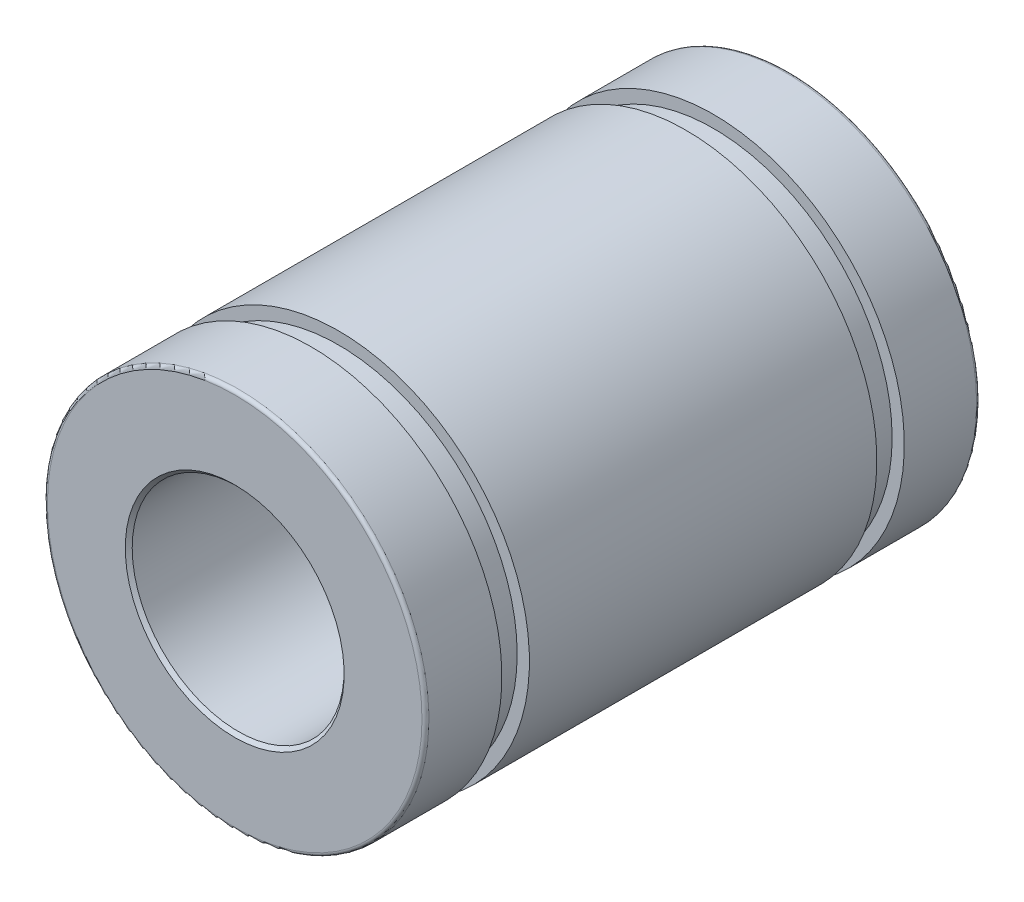
ISO-10303-21;
HEADER;
FILE_DESCRIPTION(('STEP AP214'),'2;1');
FILE_NAME('part.step','',(''),(''),'','','');
FILE_SCHEMA(('AUTOMOTIVE_DESIGN { 1 0 10303 214 1 1 1 1 }'));
ENDSEC;
DATA;
#1=APPLICATION_CONTEXT('core data for automotive mechanical design processes');
#2=APPLICATION_PROTOCOL_DEFINITION('international standard','automotive_design',2000,#1);
#3=PRODUCT_CONTEXT('',#1,'mechanical');
#4=PRODUCT('Part','Part','',(#3));
#5=PRODUCT_RELATED_PRODUCT_CATEGORY('part','',(#4));
#6=PRODUCT_DEFINITION_FORMATION('','',#4);
#7=PRODUCT_DEFINITION_CONTEXT('part definition',#1,'design');
#8=PRODUCT_DEFINITION('design','',#6,#7);
#9=PRODUCT_DEFINITION_SHAPE('','',#8);
#10=(LENGTH_UNIT() NAMED_UNIT(*) SI_UNIT(.MILLI.,.METRE.));
#11=(NAMED_UNIT(*) PLANE_ANGLE_UNIT() SI_UNIT($,.RADIAN.));
#12=(NAMED_UNIT(*) SI_UNIT($,.STERADIAN.) SOLID_ANGLE_UNIT());
#13=UNCERTAINTY_MEASURE_WITH_UNIT(LENGTH_MEASURE(1.E-05),#10,'distance_accuracy_value','');
#14=(GEOMETRIC_REPRESENTATION_CONTEXT(3) GLOBAL_UNCERTAINTY_ASSIGNED_CONTEXT((#13)) GLOBAL_UNIT_ASSIGNED_CONTEXT((#10,
#11,#12)) REPRESENTATION_CONTEXT('',''));
#15=CARTESIAN_POINT('',(0.,0.,0.));
#16=DIRECTION('',(0.,0.,1.));
#17=DIRECTION('',(1.,0.,0.));
#18=AXIS2_PLACEMENT_3D('',#15,#16,#17);
#19=CARTESIAN_POINT('',(0.,0.,0.1000000004571));
#20=DIRECTION('',(0.,0.,-1.));
#21=DIRECTION('',(0.,-1.,0.));
#22=AXIS2_PLACEMENT_3D('',#19,#20,#21);
#23=CONICAL_SURFACE('',#22,6.199999999543,0.785398163397448);
#24=CARTESIAN_POINT('',(0.,0.,0.2));
#25=DIRECTION('',(0.,0.,1.));
#26=DIRECTION('',(-1.,0.,0.));
#27=AXIS2_PLACEMENT_3D('',#24,#25,#26);
#28=CIRCLE('',#27,6.1);
#29=CARTESIAN_POINT('',(-6.1,0.,0.2));
#30=VERTEX_POINT('',#29);
#31=CARTESIAN_POINT('',(0.,6.1,0.200000000000062));
#32=VERTEX_POINT('',#31);
#33=EDGE_CURVE('E195',#30,#32,#28,.T.);
#34=ORIENTED_EDGE('',*,*,#33,.T.);
#35=DIRECTION('',(0.,0.707106781186548,-0.707106781186548));
#36=VECTOR('',#35,1.);
#37=CARTESIAN_POINT('',(0.,6.19999999954298,0.1000000004571));
#38=LINE('',#37,#36);
#39=CARTESIAN_POINT('',(0.,6.3,0.));
#40=VERTEX_POINT('',#39);
#41=EDGE_CURVE('E11',#32,#40,#38,.T.);
#42=ORIENTED_EDGE('',*,*,#41,.T.);
#43=CARTESIAN_POINT('',(0.,0.,0.));
#44=DIRECTION('',(0.,0.,1.));
#45=DIRECTION('',(-1.,0.,0.));
#46=AXIS2_PLACEMENT_3D('',#43,#44,#45);
#47=CIRCLE('',#46,6.3);
#48=EDGE_CURVE('E164',#40,#40,#47,.T.);
#49=ORIENTED_EDGE('',*,*,#48,.F.);
#50=ORIENTED_EDGE('',*,*,#41,.F.);
#51=CARTESIAN_POINT('',(0.,0.,0.2));
#52=DIRECTION('',(0.,0.,1.));
#53=DIRECTION('',(-1.,0.,0.));
#54=AXIS2_PLACEMENT_3D('',#51,#52,#53);
#55=CIRCLE('',#54,6.1);
#56=EDGE_CURVE('E28',#32,#30,#55,.T.);
#57=ORIENTED_EDGE('',*,*,#56,.T.);
#58=EDGE_LOOP('',(#34,#42,#49,#50,#57));
#59=FACE_BOUND('',#58,.T.);
#60=ADVANCED_FACE('F17',(#59),#23,.F.);
#61=CARTESIAN_POINT('',(0.,0.,0.));
#62=DIRECTION('',(0.,0.,1.));
#63=DIRECTION('',(1.,0.,0.));
#64=AXIS2_PLACEMENT_3D('',#61,#62,#63);
#65=CYLINDRICAL_SURFACE('',#64,6.1);
#66=ORIENTED_EDGE('',*,*,#33,.F.);
#67=DIRECTION('',(0.,0.,1.));
#68=VECTOR('',#67,1.);
#69=CARTESIAN_POINT('',(-6.1,0.,0.));
#70=LINE('',#69,#68);
#71=CARTESIAN_POINT('',(-6.1,0.,31.72));
#72=VERTEX_POINT('',#71);
#73=EDGE_CURVE('E199',#30,#72,#70,.T.);
#74=ORIENTED_EDGE('',*,*,#73,.T.);
#75=CARTESIAN_POINT('',(0.,0.,31.72));
#76=DIRECTION('',(0.,0.,-1.));
#77=DIRECTION('',(-1.,0.,0.));
#78=AXIS2_PLACEMENT_3D('',#75,#76,#77);
#79=CIRCLE('',#78,6.1);
#80=CARTESIAN_POINT('',(0.,6.1000000000015,31.7199999999985));
#81=VERTEX_POINT('',#80);
#82=EDGE_CURVE('E155',#81,#72,#79,.T.);
#83=ORIENTED_EDGE('',*,*,#82,.F.);
#84=CARTESIAN_POINT('',(0.,0.,31.72));
#85=DIRECTION('',(0.,0.,-1.));
#86=DIRECTION('',(-1.,0.,0.));
#87=AXIS2_PLACEMENT_3D('',#84,#85,#86);
#88=CIRCLE('',#87,6.1);
#89=EDGE_CURVE('E159',#72,#81,#88,.T.);
#90=ORIENTED_EDGE('',*,*,#89,.F.);
#91=ORIENTED_EDGE('',*,*,#73,.F.);
#92=ORIENTED_EDGE('',*,*,#56,.F.);
#93=EDGE_LOOP('',(#66,#74,#83,#90,#91,#92));
#94=FACE_BOUND('',#93,.T.);
#95=ADVANCED_FACE('F252',(#94),#65,.F.);
#96=CARTESIAN_POINT('',(0.,0.,31.81999999954));
#97=DIRECTION('',(0.,0.,1.));
#98=DIRECTION('',(0.,-1.,0.));
#99=AXIS2_PLACEMENT_3D('',#96,#97,#98);
#100=CONICAL_SURFACE('',#99,6.199999999543,0.785398163397448);
#101=ORIENTED_EDGE('',*,*,#82,.T.);
#102=ORIENTED_EDGE('',*,*,#89,.T.);
#103=DIRECTION('',(0.,0.707106781186548,0.707106781186548));
#104=VECTOR('',#103,1.);
#105=CARTESIAN_POINT('',(0.,6.199999999543,31.81999999954));
#106=LINE('',#105,#104);
#107=CARTESIAN_POINT('',(0.,6.3000000000015,31.9199999999985));
#108=VERTEX_POINT('',#107);
#109=EDGE_CURVE('E192',#81,#108,#106,.T.);
#110=ORIENTED_EDGE('',*,*,#109,.T.);
#111=CARTESIAN_POINT('',(0.,0.,31.92));
#112=DIRECTION('',(0.,0.,-1.));
#113=DIRECTION('',(-1.,0.,0.));
#114=AXIS2_PLACEMENT_3D('',#111,#112,#113);
#115=CIRCLE('',#114,6.3);
#116=EDGE_CURVE('E160',#108,#108,#115,.T.);
#117=ORIENTED_EDGE('',*,*,#116,.F.);
#118=ORIENTED_EDGE('',*,*,#109,.F.);
#119=EDGE_LOOP('',(#101,#102,#110,#117,#118));
#120=FACE_BOUND('',#119,.T.);
#121=ADVANCED_FACE('F257',(#120),#100,.F.);
#122=CARTESIAN_POINT('',(0.,0.,31.92));
#123=DIRECTION('',(0.,0.,1.));
#124=DIRECTION('',(1.,0.,0.));
#125=AXIS2_PLACEMENT_3D('',#122,#123,#124);
#126=PLANE('',#125);
#127=ORIENTED_EDGE('',*,*,#116,.T.);
#128=EDGE_LOOP('',(#127));
#129=FACE_BOUND('',#128,.T.);
#130=CARTESIAN_POINT('',(0.,0.,31.92));
#131=DIRECTION('',(0.,0.,1.));
#132=DIRECTION('',(1.,0.,0.));
#133=AXIS2_PLACEMENT_3D('',#130,#131,#132);
#134=CIRCLE('',#133,10.78);
#135=CARTESIAN_POINT('',(-10.7797902250438,0.0672510524055583,31.92));
#136=VERTEX_POINT('',#135);
#137=EDGE_CURVE('E122',#136,#136,#134,.T.);
#138=ORIENTED_EDGE('',*,*,#137,.T.);
#139=EDGE_LOOP('',(#138));
#140=FACE_BOUND('',#139,.T.);
#141=ADVANCED_FACE('F19',(#129,#140),#126,.T.);
#142=CARTESIAN_POINT('',(0.,0.,31.72));
#143=DIRECTION('',(0.,0.,1.));
#144=DIRECTION('',(0.99998054035657,-0.00623850207843781,0.));
#145=AXIS2_PLACEMENT_3D('',#142,#143,#144);
#146=TOROIDAL_SURFACE('',#145,10.78,0.2);
#147=ORIENTED_EDGE('',*,*,#137,.F.);
#148=CARTESIAN_POINT('',(-10.7797902250438,0.0672510524055583,31.72));
#149=DIRECTION('',(-0.00623850207843769,-0.99998054035657,0.));
#150=DIRECTION('',(-0.99998054035657,0.00623850207843769,0.));
#151=AXIS2_PLACEMENT_3D('',#148,#149,#150);
#152=CIRCLE('',#151,0.2);
#153=CARTESIAN_POINT('',(-10.9797863331151,0.0684987528212458,31.72));
#154=VERTEX_POINT('',#153);
#155=EDGE_CURVE('E119',#136,#154,#152,.T.);
#156=ORIENTED_EDGE('',*,*,#155,.T.);
#157=CARTESIAN_POINT('',(0.,0.,31.72));
#158=DIRECTION('',(0.,0.,1.));
#159=DIRECTION('',(1.,0.,0.));
#160=AXIS2_PLACEMENT_3D('',#157,#158,#159);
#161=CIRCLE('',#160,10.98);
#162=CARTESIAN_POINT('',(-10.98,0.,31.72));
#163=VERTEX_POINT('',#162);
#164=EDGE_CURVE('E21',#154,#163,#161,.T.);
#165=ORIENTED_EDGE('',*,*,#164,.T.);
#166=CARTESIAN_POINT('',(0.,0.,31.72));
#167=DIRECTION('',(0.,0.,1.));
#168=DIRECTION('',(1.,0.,0.));
#169=AXIS2_PLACEMENT_3D('',#166,#167,#168);
#170=CIRCLE('',#169,10.98);
#171=EDGE_CURVE('E118',#163,#154,#170,.T.);
#172=ORIENTED_EDGE('',*,*,#171,.T.);
#173=ORIENTED_EDGE('',*,*,#155,.F.);
#174=EDGE_LOOP('',(#147,#156,#165,#172,#173));
#175=FACE_BOUND('',#174,.T.);
#176=ADVANCED_FACE('F116',(#175),#146,.T.);
#177=CARTESIAN_POINT('',(0.,0.,27.52));
#178=DIRECTION('',(0.,0.,1.));
#179=DIRECTION('',(1.,0.,0.));
#180=AXIS2_PLACEMENT_3D('',#177,#178,#179);
#181=CYLINDRICAL_SURFACE('',#180,10.98);
#182=ORIENTED_EDGE('',*,*,#171,.F.);
#183=DIRECTION('',(0.,0.,-1.));
#184=VECTOR('',#183,1.);
#185=CARTESIAN_POINT('',(-10.98,0.,27.52));
#186=LINE('',#185,#184);
#187=CARTESIAN_POINT('',(-10.98,0.,27.52));
#188=VERTEX_POINT('',#187);
#189=EDGE_CURVE('E123',#163,#188,#186,.T.);
#190=ORIENTED_EDGE('',*,*,#189,.T.);
#191=CARTESIAN_POINT('',(0.,0.,27.52));
#192=DIRECTION('',(0.,0.,1.));
#193=DIRECTION('',(1.,0.,0.));
#194=AXIS2_PLACEMENT_3D('',#191,#192,#193);
#195=CIRCLE('',#194,10.98);
#196=EDGE_CURVE('E127',#188,#188,#195,.T.);
#197=ORIENTED_EDGE('',*,*,#196,.T.);
#198=ORIENTED_EDGE('',*,*,#189,.F.);
#199=ORIENTED_EDGE('',*,*,#164,.F.);
#200=EDGE_LOOP('',(#182,#190,#197,#198,#199));
#201=FACE_BOUND('',#200,.T.);
#202=ADVANCED_FACE('F125',(#201),#181,.T.);
#203=CARTESIAN_POINT('',(0.,0.,27.52));
#204=DIRECTION('',(0.,0.,1.));
#205=DIRECTION('',(1.,0.,0.));
#206=AXIS2_PLACEMENT_3D('',#203,#204,#205);
#207=PLANE('',#206);
#208=CARTESIAN_POINT('',(0.,0.,27.52));
#209=DIRECTION('',(0.,0.,1.));
#210=DIRECTION('',(1.,0.,0.));
#211=AXIS2_PLACEMENT_3D('',#208,#209,#210);
#212=CIRCLE('',#211,10.28);
#213=CARTESIAN_POINT('',(-10.28,0.,27.52));
#214=VERTEX_POINT('',#213);
#215=EDGE_CURVE('E206',#214,#214,#212,.T.);
#216=ORIENTED_EDGE('',*,*,#215,.T.);
#217=EDGE_LOOP('',(#216));
#218=FACE_BOUND('',#217,.T.);
#219=ORIENTED_EDGE('',*,*,#196,.F.);
#220=EDGE_LOOP('',(#219));
#221=FACE_BOUND('',#220,.T.);
#222=ADVANCED_FACE('F265',(#218,#221),#207,.F.);
#223=CARTESIAN_POINT('',(0.,0.,25.94));
#224=DIRECTION('',(0.,0.,1.));
#225=DIRECTION('',(1.,0.,0.));
#226=AXIS2_PLACEMENT_3D('',#223,#224,#225);
#227=CYLINDRICAL_SURFACE('',#226,10.28);
#228=ORIENTED_EDGE('',*,*,#215,.F.);
#229=DIRECTION('',(0.,0.,-1.));
#230=VECTOR('',#229,1.);
#231=CARTESIAN_POINT('',(-10.28,0.,25.94));
#232=LINE('',#231,#230);
#233=CARTESIAN_POINT('',(-10.28,0.,25.94));
#234=VERTEX_POINT('',#233);
#235=EDGE_CURVE('E136',#214,#234,#232,.T.);
#236=ORIENTED_EDGE('',*,*,#235,.T.);
#237=CARTESIAN_POINT('',(0.,0.,25.94));
#238=DIRECTION('',(0.,0.,1.));
#239=DIRECTION('',(1.,0.,0.));
#240=AXIS2_PLACEMENT_3D('',#237,#238,#239);
#241=CIRCLE('',#240,10.28);
#242=EDGE_CURVE('E148',#234,#234,#241,.T.);
#243=ORIENTED_EDGE('',*,*,#242,.T.);
#244=ORIENTED_EDGE('',*,*,#235,.F.);
#245=EDGE_LOOP('',(#228,#236,#243,#244));
#246=FACE_BOUND('',#245,.T.);
#247=ADVANCED_FACE('F262',(#246),#227,.T.);
#248=CARTESIAN_POINT('',(0.,0.,25.94));
#249=DIRECTION('',(0.,0.,1.));
#250=DIRECTION('',(1.,0.,0.));
#251=AXIS2_PLACEMENT_3D('',#248,#249,#250);
#252=PLANE('',#251);
#253=ORIENTED_EDGE('',*,*,#242,.F.);
#254=EDGE_LOOP('',(#253));
#255=FACE_BOUND('',#254,.T.);
#256=CARTESIAN_POINT('',(0.,0.,25.94));
#257=DIRECTION('',(0.,0.,1.));
#258=DIRECTION('',(1.,0.,0.));
#259=AXIS2_PLACEMENT_3D('',#256,#257,#258);
#260=CIRCLE('',#259,10.985);
#261=CARTESIAN_POINT('',(-10.985,0.,25.94));
#262=VERTEX_POINT('',#261);
#263=EDGE_CURVE('E149',#262,#262,#260,.T.);
#264=ORIENTED_EDGE('',*,*,#263,.T.);
#265=EDGE_LOOP('',(#264));
#266=FACE_BOUND('',#265,.T.);
#267=ADVANCED_FACE('F233',(#255,#266),#252,.T.);
#268=CARTESIAN_POINT('',(0.,0.,5.94));
#269=DIRECTION('',(0.,0.,1.));
#270=DIRECTION('',(1.,0.,0.));
#271=AXIS2_PLACEMENT_3D('',#268,#269,#270);
#272=CYLINDRICAL_SURFACE('',#271,10.985);
#273=ORIENTED_EDGE('',*,*,#263,.F.);
#274=DIRECTION('',(0.,0.,-1.));
#275=VECTOR('',#274,1.);
#276=CARTESIAN_POINT('',(-10.985,0.,5.94));
#277=LINE('',#276,#275);
#278=CARTESIAN_POINT('',(-10.985,0.,5.94));
#279=VERTEX_POINT('',#278);
#280=EDGE_CURVE('E144',#262,#279,#277,.T.);
#281=ORIENTED_EDGE('',*,*,#280,.T.);
#282=CARTESIAN_POINT('',(0.,0.,5.94));
#283=DIRECTION('',(0.,0.,1.));
#284=DIRECTION('',(1.,0.,0.));
#285=AXIS2_PLACEMENT_3D('',#282,#283,#284);
#286=CIRCLE('',#285,10.985);
#287=EDGE_CURVE('E167',#279,#279,#286,.T.);
#288=ORIENTED_EDGE('',*,*,#287,.T.);
#289=ORIENTED_EDGE('',*,*,#280,.F.);
#290=EDGE_LOOP('',(#273,#281,#288,#289));
#291=FACE_BOUND('',#290,.T.);
#292=ADVANCED_FACE('F235',(#291),#272,.T.);
#293=CARTESIAN_POINT('',(0.,0.,5.94));
#294=DIRECTION('',(0.,0.,1.));
#295=DIRECTION('',(1.,0.,0.));
#296=AXIS2_PLACEMENT_3D('',#293,#294,#295);
#297=PLANE('',#296);
#298=CARTESIAN_POINT('',(0.,0.,5.94));
#299=DIRECTION('',(0.,0.,1.));
#300=DIRECTION('',(1.,0.,0.));
#301=AXIS2_PLACEMENT_3D('',#298,#299,#300);
#302=CIRCLE('',#301,10.285);
#303=CARTESIAN_POINT('',(-10.285,0.,5.94));
#304=VERTEX_POINT('',#303);
#305=EDGE_CURVE('E168',#304,#304,#302,.T.);
#306=ORIENTED_EDGE('',*,*,#305,.T.);
#307=EDGE_LOOP('',(#306));
#308=FACE_BOUND('',#307,.T.);
#309=ORIENTED_EDGE('',*,*,#287,.F.);
#310=EDGE_LOOP('',(#309));
#311=FACE_BOUND('',#310,.T.);
#312=ADVANCED_FACE('F238',(#308,#311),#297,.F.);
#313=CARTESIAN_POINT('',(0.,0.,4.36));
#314=DIRECTION('',(0.,0.,1.));
#315=DIRECTION('',(1.,0.,0.));
#316=AXIS2_PLACEMENT_3D('',#313,#314,#315);
#317=CYLINDRICAL_SURFACE('',#316,10.285);
#318=ORIENTED_EDGE('',*,*,#305,.F.);
#319=DIRECTION('',(0.,0.,-1.));
#320=VECTOR('',#319,1.);
#321=CARTESIAN_POINT('',(-10.285,0.,4.36));
#322=LINE('',#321,#320);
#323=CARTESIAN_POINT('',(-10.285,0.,4.36));
#324=VERTEX_POINT('',#323);
#325=EDGE_CURVE('E165',#304,#324,#322,.T.);
#326=ORIENTED_EDGE('',*,*,#325,.T.);
#327=CARTESIAN_POINT('',(0.,0.,4.36));
#328=DIRECTION('',(0.,0.,1.));
#329=DIRECTION('',(1.,0.,0.));
#330=AXIS2_PLACEMENT_3D('',#327,#328,#329);
#331=CIRCLE('',#330,10.285);
#332=EDGE_CURVE('E179',#324,#324,#331,.T.);
#333=ORIENTED_EDGE('',*,*,#332,.T.);
#334=ORIENTED_EDGE('',*,*,#325,.F.);
#335=EDGE_LOOP('',(#318,#326,#333,#334));
#336=FACE_BOUND('',#335,.T.);
#337=ADVANCED_FACE('F240',(#336),#317,.T.);
#338=CARTESIAN_POINT('',(0.,0.,4.36));
#339=DIRECTION('',(0.,0.,1.));
#340=DIRECTION('',(1.,0.,0.));
#341=AXIS2_PLACEMENT_3D('',#338,#339,#340);
#342=PLANE('',#341);
#343=ORIENTED_EDGE('',*,*,#332,.F.);
#344=EDGE_LOOP('',(#343));
#345=FACE_BOUND('',#344,.T.);
#346=CARTESIAN_POINT('',(0.,0.,4.36));
#347=DIRECTION('',(0.,0.,1.));
#348=DIRECTION('',(-1.,0.,0.));
#349=AXIS2_PLACEMENT_3D('',#346,#347,#348);
#350=CIRCLE('',#349,10.985);
#351=CARTESIAN_POINT('',(-10.985,0.,4.36));
#352=VERTEX_POINT('',#351);
#353=EDGE_CURVE('E200',#352,#352,#350,.T.);
#354=ORIENTED_EDGE('',*,*,#353,.T.);
#355=EDGE_LOOP('',(#354));
#356=FACE_BOUND('',#355,.T.);
#357=ADVANCED_FACE('F247',(#345,#356),#342,.T.);
#358=CARTESIAN_POINT('',(0.,0.,0.));
#359=DIRECTION('',(0.,0.,1.));
#360=DIRECTION('',(1.,0.,0.));
#361=AXIS2_PLACEMENT_3D('',#358,#359,#360);
#362=CYLINDRICAL_SURFACE('',#361,10.985);
#363=ORIENTED_EDGE('',*,*,#353,.F.);
#364=DIRECTION('',(0.,0.,-1.));
#365=VECTOR('',#364,1.);
#366=CARTESIAN_POINT('',(-10.985,0.,0.));
#367=LINE('',#366,#365);
#368=CARTESIAN_POINT('',(-10.985,0.,0.2));
#369=VERTEX_POINT('',#368);
#370=EDGE_CURVE('E185',#352,#369,#367,.T.);
#371=ORIENTED_EDGE('',*,*,#370,.T.);
#372=CARTESIAN_POINT('',(0.,0.,0.2));
#373=DIRECTION('',(0.,0.,-1.));
#374=DIRECTION('',(-1.,0.,0.));
#375=AXIS2_PLACEMENT_3D('',#372,#373,#374);
#376=CIRCLE('',#375,10.985);
#377=CARTESIAN_POINT('',(10.9845690225326,0.0973056484356944,0.2));
#378=VERTEX_POINT('',#377);
#379=EDGE_CURVE('E139',#378,#369,#376,.T.);
#380=ORIENTED_EDGE('',*,*,#379,.F.);
#381=CARTESIAN_POINT('',(0.,0.,0.2));
#382=DIRECTION('',(0.,0.,-1.));
#383=DIRECTION('',(-1.,0.,0.));
#384=AXIS2_PLACEMENT_3D('',#381,#382,#383);
#385=CIRCLE('',#384,10.985);
#386=EDGE_CURVE('E150',#369,#378,#385,.T.);
#387=ORIENTED_EDGE('',*,*,#386,.F.);
#388=ORIENTED_EDGE('',*,*,#370,.F.);
#389=EDGE_LOOP('',(#363,#371,#380,#387,#388));
#390=FACE_BOUND('',#389,.T.);
#391=ADVANCED_FACE('F271',(#390),#362,.T.);
#392=CARTESIAN_POINT('',(0.,0.,0.2));
#393=DIRECTION('',(0.,0.,1.));
#394=DIRECTION('',(-0.999960766730322,-0.00885804719487419,0.));
#395=AXIS2_PLACEMENT_3D('',#392,#393,#394);
#396=TOROIDAL_SURFACE('',#395,10.785,0.2);
#397=ORIENTED_EDGE('',*,*,#379,.T.);
#398=ORIENTED_EDGE('',*,*,#386,.T.);
#399=CARTESIAN_POINT('',(10.7845768691865,0.0955340389967195,0.2));
#400=DIRECTION('',(-0.00885804719487432,0.999960766730322,0.));
#401=DIRECTION('',(0.999960766730322,0.00885804719487432,0.));
#402=AXIS2_PLACEMENT_3D('',#399,#400,#401);
#403=CIRCLE('',#402,0.2);
#404=CARTESIAN_POINT('',(10.7845768691865,0.0955340389967195,0.));
#405=VERTEX_POINT('',#404);
#406=EDGE_CURVE('E154',#378,#405,#403,.T.);
#407=ORIENTED_EDGE('',*,*,#406,.T.);
#408=CARTESIAN_POINT('',(0.,0.,0.));
#409=DIRECTION('',(0.,0.,-1.));
#410=DIRECTION('',(-1.,0.,0.));
#411=AXIS2_PLACEMENT_3D('',#408,#409,#410);
#412=CIRCLE('',#411,10.785);
#413=EDGE_CURVE('E161',#405,#405,#412,.T.);
#414=ORIENTED_EDGE('',*,*,#413,.F.);
#415=ORIENTED_EDGE('',*,*,#406,.F.);
#416=EDGE_LOOP('',(#397,#398,#407,#414,#415));
#417=FACE_BOUND('',#416,.T.);
#418=ADVANCED_FACE('F276',(#417),#396,.T.);
#419=CARTESIAN_POINT('',(0.,0.,0.));
#420=DIRECTION('',(0.,0.,1.));
#421=DIRECTION('',(1.,0.,0.));
#422=AXIS2_PLACEMENT_3D('',#419,#420,#421);
#423=PLANE('',#422);
#424=ORIENTED_EDGE('',*,*,#48,.T.);
#425=EDGE_LOOP('',(#424));
#426=FACE_BOUND('',#425,.T.);
#427=ORIENTED_EDGE('',*,*,#413,.T.);
#428=EDGE_LOOP('',(#427));
#429=FACE_BOUND('',#428,.T.);
#430=ADVANCED_FACE('F366',(#426,#429),#423,.F.);
#431=CLOSED_SHELL('',(#60,#95,#121,#141,#176,#202,#222,#247,#267,#292,#312,#337,#357,#391,#418,#430));
#432=MANIFOLD_SOLID_BREP('B1',#431);
#433=ADVANCED_BREP_SHAPE_REPRESENTATION('',(#18,#432),#14);
#434=SHAPE_DEFINITION_REPRESENTATION(#9,#433);
ENDSEC;
END-ISO-10303-21;
